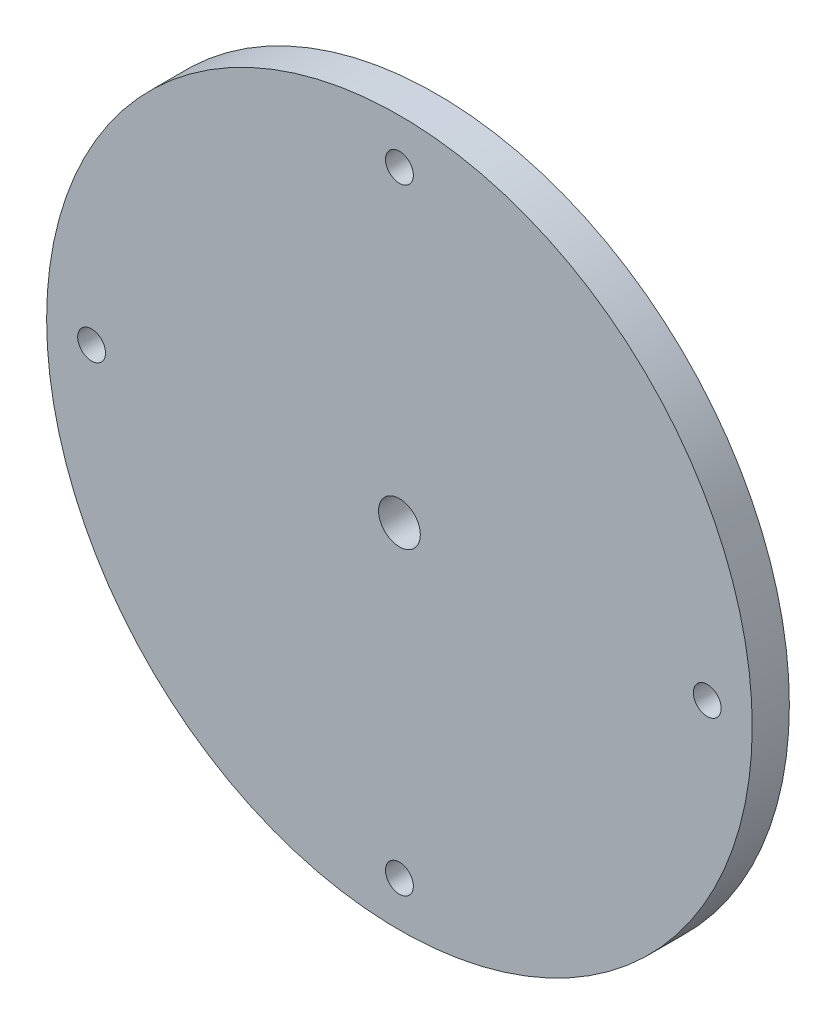
ISO-10303-21;
HEADER;
FILE_DESCRIPTION(('STEP AP214'),'2;1');
FILE_NAME('part.step','',(''),(''),'','','');
FILE_SCHEMA(('AUTOMOTIVE_DESIGN { 1 0 10303 214 1 1 1 1 }'));
ENDSEC;
DATA;
#1=APPLICATION_CONTEXT('core data for automotive mechanical design processes');
#2=APPLICATION_PROTOCOL_DEFINITION('international standard','automotive_design',2000,#1);
#3=PRODUCT_CONTEXT('',#1,'mechanical');
#4=PRODUCT('Part','Part','',(#3));
#5=PRODUCT_RELATED_PRODUCT_CATEGORY('part','',(#4));
#6=PRODUCT_DEFINITION_FORMATION('','',#4);
#7=PRODUCT_DEFINITION_CONTEXT('part definition',#1,'design');
#8=PRODUCT_DEFINITION('design','',#6,#7);
#9=PRODUCT_DEFINITION_SHAPE('','',#8);
#10=(LENGTH_UNIT() NAMED_UNIT(*) SI_UNIT(.MILLI.,.METRE.));
#11=(NAMED_UNIT(*) PLANE_ANGLE_UNIT() SI_UNIT($,.RADIAN.));
#12=(NAMED_UNIT(*) SI_UNIT($,.STERADIAN.) SOLID_ANGLE_UNIT());
#13=UNCERTAINTY_MEASURE_WITH_UNIT(LENGTH_MEASURE(1.E-05),#10,'distance_accuracy_value','');
#14=(GEOMETRIC_REPRESENTATION_CONTEXT(3) GLOBAL_UNCERTAINTY_ASSIGNED_CONTEXT((#13)) GLOBAL_UNIT_ASSIGNED_CONTEXT((#10,
#11,#12)) REPRESENTATION_CONTEXT('',''));
#15=CARTESIAN_POINT('',(0.,0.,0.));
#16=DIRECTION('',(0.,0.,1.));
#17=DIRECTION('',(1.,0.,0.));
#18=AXIS2_PLACEMENT_3D('',#15,#16,#17);
#19=CARTESIAN_POINT('',(0.,0.,8.));
#20=DIRECTION('',(0.,0.,1.));
#21=DIRECTION('',(1.,0.,0.));
#22=AXIS2_PLACEMENT_3D('',#19,#20,#21);
#23=PLANE('',#22);
#24=CARTESIAN_POINT('',(-66.31,0.,8.));
#25=DIRECTION('',(0.,0.,1.));
#26=DIRECTION('',(1.,0.,0.));
#27=AXIS2_PLACEMENT_3D('',#24,#25,#26);
#28=CIRCLE('',#27,3.00000000000001);
#29=CARTESIAN_POINT('',(-63.31,0.,8.));
#30=VERTEX_POINT('',#29);
#31=EDGE_CURVE('E62',#30,#30,#28,.T.);
#32=ORIENTED_EDGE('',*,*,#31,.F.);
#33=EDGE_LOOP('',(#32));
#34=FACE_BOUND('',#33,.T.);
#35=CARTESIAN_POINT('',(0.,-66.31,8.));
#36=DIRECTION('',(0.,0.,1.));
#37=DIRECTION('',(1.,0.,0.));
#38=AXIS2_PLACEMENT_3D('',#35,#36,#37);
#39=CIRCLE('',#38,3.);
#40=CARTESIAN_POINT('',(3.,-66.31,8.));
#41=VERTEX_POINT('',#40);
#42=EDGE_CURVE('E50',#41,#41,#39,.T.);
#43=ORIENTED_EDGE('',*,*,#42,.F.);
#44=EDGE_LOOP('',(#43));
#45=FACE_BOUND('',#44,.T.);
#46=CARTESIAN_POINT('',(0.,0.,8.));
#47=DIRECTION('',(0.,0.,1.));
#48=DIRECTION('',(1.,0.,0.));
#49=AXIS2_PLACEMENT_3D('',#46,#47,#48);
#50=CIRCLE('',#49,76.);
#51=CARTESIAN_POINT('',(76.,0.,8.));
#52=VERTEX_POINT('',#51);
#53=EDGE_CURVE('E10',#52,#52,#50,.T.);
#54=ORIENTED_EDGE('',*,*,#53,.T.);
#55=EDGE_LOOP('',(#54));
#56=FACE_BOUND('',#55,.T.);
#57=CARTESIAN_POINT('',(0.,66.31,8.));
#58=DIRECTION('',(0.,0.,1.));
#59=DIRECTION('',(1.,0.,0.));
#60=AXIS2_PLACEMENT_3D('',#57,#58,#59);
#61=CIRCLE('',#60,3.);
#62=CARTESIAN_POINT('',(3.,66.31,8.));
#63=VERTEX_POINT('',#62);
#64=EDGE_CURVE('E45',#63,#63,#61,.T.);
#65=ORIENTED_EDGE('',*,*,#64,.F.);
#66=EDGE_LOOP('',(#65));
#67=FACE_BOUND('',#66,.T.);
#68=CARTESIAN_POINT('',(66.31,0.,8.));
#69=DIRECTION('',(0.,0.,1.));
#70=DIRECTION('',(1.,0.,0.));
#71=AXIS2_PLACEMENT_3D('',#68,#69,#70);
#72=CIRCLE('',#71,3.00000000000001);
#73=CARTESIAN_POINT('',(69.31,0.,8.));
#74=VERTEX_POINT('',#73);
#75=EDGE_CURVE('E56',#74,#74,#72,.T.);
#76=ORIENTED_EDGE('',*,*,#75,.F.);
#77=EDGE_LOOP('',(#76));
#78=FACE_BOUND('',#77,.T.);
#79=CARTESIAN_POINT('',(0.,0.,8.));
#80=DIRECTION('',(0.,0.,1.));
#81=DIRECTION('',(1.,0.,0.));
#82=AXIS2_PLACEMENT_3D('',#79,#80,#81);
#83=CIRCLE('',#82,4.5);
#84=CARTESIAN_POINT('',(4.5,0.,8.));
#85=VERTEX_POINT('',#84);
#86=EDGE_CURVE('E68',#85,#85,#83,.T.);
#87=ORIENTED_EDGE('',*,*,#86,.F.);
#88=EDGE_LOOP('',(#87));
#89=FACE_BOUND('',#88,.T.);
#90=ADVANCED_FACE('F34',(#34,#45,#56,#67,#78,#89),#23,.T.);
#91=CARTESIAN_POINT('',(0.,0.,0.));
#92=DIRECTION('',(0.,0.,1.));
#93=DIRECTION('',(1.,0.,0.));
#94=AXIS2_PLACEMENT_3D('',#91,#92,#93);
#95=PLANE('',#94);
#96=CARTESIAN_POINT('',(0.,0.,0.));
#97=DIRECTION('',(0.,0.,1.));
#98=DIRECTION('',(1.,0.,0.));
#99=AXIS2_PLACEMENT_3D('',#96,#97,#98);
#100=CIRCLE('',#99,76.);
#101=CARTESIAN_POINT('',(76.,0.,0.));
#102=VERTEX_POINT('',#101);
#103=EDGE_CURVE('E38',#102,#102,#100,.T.);
#104=ORIENTED_EDGE('',*,*,#103,.F.);
#105=EDGE_LOOP('',(#104));
#106=FACE_BOUND('',#105,.T.);
#107=CARTESIAN_POINT('',(0.,66.31,0.));
#108=DIRECTION('',(0.,0.,1.));
#109=DIRECTION('',(1.,0.,0.));
#110=AXIS2_PLACEMENT_3D('',#107,#108,#109);
#111=CIRCLE('',#110,3.);
#112=CARTESIAN_POINT('',(3.,66.31,0.));
#113=VERTEX_POINT('',#112);
#114=EDGE_CURVE('E47',#113,#113,#111,.T.);
#115=ORIENTED_EDGE('',*,*,#114,.T.);
#116=EDGE_LOOP('',(#115));
#117=FACE_BOUND('',#116,.T.);
#118=CARTESIAN_POINT('',(0.,-66.31,0.));
#119=DIRECTION('',(0.,0.,1.));
#120=DIRECTION('',(1.,0.,0.));
#121=AXIS2_PLACEMENT_3D('',#118,#119,#120);
#122=CIRCLE('',#121,3.);
#123=CARTESIAN_POINT('',(3.,-66.31,0.));
#124=VERTEX_POINT('',#123);
#125=EDGE_CURVE('E53',#124,#124,#122,.T.);
#126=ORIENTED_EDGE('',*,*,#125,.T.);
#127=EDGE_LOOP('',(#126));
#128=FACE_BOUND('',#127,.T.);
#129=CARTESIAN_POINT('',(66.31,0.,0.));
#130=DIRECTION('',(0.,0.,1.));
#131=DIRECTION('',(1.,0.,0.));
#132=AXIS2_PLACEMENT_3D('',#129,#130,#131);
#133=CIRCLE('',#132,3.00000000000001);
#134=CARTESIAN_POINT('',(69.31,0.,0.));
#135=VERTEX_POINT('',#134);
#136=EDGE_CURVE('E59',#135,#135,#133,.T.);
#137=ORIENTED_EDGE('',*,*,#136,.T.);
#138=EDGE_LOOP('',(#137));
#139=FACE_BOUND('',#138,.T.);
#140=CARTESIAN_POINT('',(-66.31,0.,0.));
#141=DIRECTION('',(0.,0.,1.));
#142=DIRECTION('',(1.,0.,0.));
#143=AXIS2_PLACEMENT_3D('',#140,#141,#142);
#144=CIRCLE('',#143,3.00000000000001);
#145=CARTESIAN_POINT('',(-63.31,0.,0.));
#146=VERTEX_POINT('',#145);
#147=EDGE_CURVE('E65',#146,#146,#144,.T.);
#148=ORIENTED_EDGE('',*,*,#147,.T.);
#149=EDGE_LOOP('',(#148));
#150=FACE_BOUND('',#149,.T.);
#151=CARTESIAN_POINT('',(0.,0.,0.));
#152=DIRECTION('',(0.,0.,1.));
#153=DIRECTION('',(1.,0.,0.));
#154=AXIS2_PLACEMENT_3D('',#151,#152,#153);
#155=CIRCLE('',#154,4.5);
#156=CARTESIAN_POINT('',(4.5,0.,0.));
#157=VERTEX_POINT('',#156);
#158=EDGE_CURVE('E71',#157,#157,#155,.T.);
#159=ORIENTED_EDGE('',*,*,#158,.T.);
#160=EDGE_LOOP('',(#159));
#161=FACE_BOUND('',#160,.T.);
#162=ADVANCED_FACE('F81',(#106,#117,#128,#139,#150,#161),#95,.F.);
#163=CARTESIAN_POINT('',(0.,0.,8.));
#164=DIRECTION('',(0.,0.,-1.));
#165=DIRECTION('',(-1.,0.,0.));
#166=AXIS2_PLACEMENT_3D('',#163,#164,#165);
#167=CYLINDRICAL_SURFACE('',#166,76.);
#168=ORIENTED_EDGE('',*,*,#53,.F.);
#169=EDGE_LOOP('',(#168));
#170=FACE_BOUND('',#169,.T.);
#171=ORIENTED_EDGE('',*,*,#103,.T.);
#172=EDGE_LOOP('',(#171));
#173=FACE_BOUND('',#172,.T.);
#174=ADVANCED_FACE('F36',(#170,#173),#167,.T.);
#175=CARTESIAN_POINT('',(0.,66.31,8.));
#176=DIRECTION('',(0.,0.,-1.));
#177=DIRECTION('',(-1.,0.,0.));
#178=AXIS2_PLACEMENT_3D('',#175,#176,#177);
#179=CYLINDRICAL_SURFACE('',#178,3.);
#180=ORIENTED_EDGE('',*,*,#64,.T.);
#181=EDGE_LOOP('',(#180));
#182=FACE_BOUND('',#181,.T.);
#183=ORIENTED_EDGE('',*,*,#114,.F.);
#184=EDGE_LOOP('',(#183));
#185=FACE_BOUND('',#184,.T.);
#186=ADVANCED_FACE('F91',(#182,#185),#179,.F.);
#187=CARTESIAN_POINT('',(0.,-66.31,8.));
#188=DIRECTION('',(0.,0.,-1.));
#189=DIRECTION('',(-1.,0.,0.));
#190=AXIS2_PLACEMENT_3D('',#187,#188,#189);
#191=CYLINDRICAL_SURFACE('',#190,3.);
#192=ORIENTED_EDGE('',*,*,#42,.T.);
#193=EDGE_LOOP('',(#192));
#194=FACE_BOUND('',#193,.T.);
#195=ORIENTED_EDGE('',*,*,#125,.F.);
#196=EDGE_LOOP('',(#195));
#197=FACE_BOUND('',#196,.T.);
#198=ADVANCED_FACE('F94',(#194,#197),#191,.F.);
#199=CARTESIAN_POINT('',(66.31,0.,8.));
#200=DIRECTION('',(0.,0.,-1.));
#201=DIRECTION('',(-1.,0.,0.));
#202=AXIS2_PLACEMENT_3D('',#199,#200,#201);
#203=CYLINDRICAL_SURFACE('',#202,3.00000000000001);
#204=ORIENTED_EDGE('',*,*,#75,.T.);
#205=EDGE_LOOP('',(#204));
#206=FACE_BOUND('',#205,.T.);
#207=ORIENTED_EDGE('',*,*,#136,.F.);
#208=EDGE_LOOP('',(#207));
#209=FACE_BOUND('',#208,.T.);
#210=ADVANCED_FACE('F98',(#206,#209),#203,.F.);
#211=CARTESIAN_POINT('',(-66.31,0.,8.));
#212=DIRECTION('',(0.,0.,-1.));
#213=DIRECTION('',(-1.,0.,0.));
#214=AXIS2_PLACEMENT_3D('',#211,#212,#213);
#215=CYLINDRICAL_SURFACE('',#214,3.00000000000001);
#216=ORIENTED_EDGE('',*,*,#31,.T.);
#217=EDGE_LOOP('',(#216));
#218=FACE_BOUND('',#217,.T.);
#219=ORIENTED_EDGE('',*,*,#147,.F.);
#220=EDGE_LOOP('',(#219));
#221=FACE_BOUND('',#220,.T.);
#222=ADVANCED_FACE('F102',(#218,#221),#215,.F.);
#223=CARTESIAN_POINT('',(0.,0.,8.));
#224=DIRECTION('',(0.,0.,-1.));
#225=DIRECTION('',(-1.,0.,0.));
#226=AXIS2_PLACEMENT_3D('',#223,#224,#225);
#227=CYLINDRICAL_SURFACE('',#226,4.5);
#228=ORIENTED_EDGE('',*,*,#86,.T.);
#229=EDGE_LOOP('',(#228));
#230=FACE_BOUND('',#229,.T.);
#231=ORIENTED_EDGE('',*,*,#158,.F.);
#232=EDGE_LOOP('',(#231));
#233=FACE_BOUND('',#232,.T.);
#234=ADVANCED_FACE('F77',(#230,#233),#227,.F.);
#235=CLOSED_SHELL('',(#90,#162,#174,#186,#198,#210,#222,#234));
#236=MANIFOLD_SOLID_BREP('B2',#235);
#237=ADVANCED_BREP_SHAPE_REPRESENTATION('',(#18,#236),#14);
#238=SHAPE_DEFINITION_REPRESENTATION(#9,#237);
ENDSEC;
END-ISO-10303-21;
